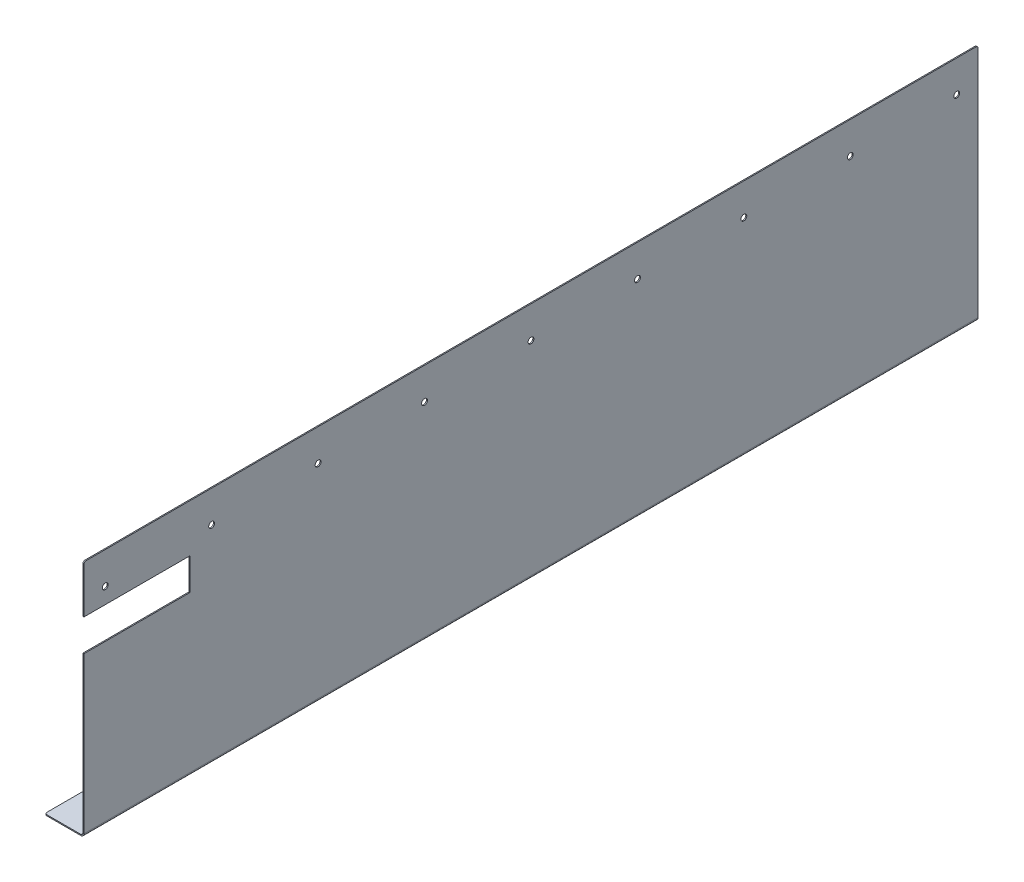
ISO-10303-21;
HEADER;
FILE_DESCRIPTION(('STEP AP214'),'2;1');
FILE_NAME('part.step','',(''),(''),'','','');
FILE_SCHEMA(('AUTOMOTIVE_DESIGN { 1 0 10303 214 1 1 1 1 }'));
ENDSEC;
DATA;
#1=APPLICATION_CONTEXT('core data for automotive mechanical design processes');
#2=APPLICATION_PROTOCOL_DEFINITION('international standard','automotive_design',2000,#1);
#3=PRODUCT_CONTEXT('',#1,'mechanical');
#4=PRODUCT('Part','Part','',(#3));
#5=PRODUCT_RELATED_PRODUCT_CATEGORY('part','',(#4));
#6=PRODUCT_DEFINITION_FORMATION('','',#4);
#7=PRODUCT_DEFINITION_CONTEXT('part definition',#1,'design');
#8=PRODUCT_DEFINITION('design','',#6,#7);
#9=PRODUCT_DEFINITION_SHAPE('','',#8);
#10=(LENGTH_UNIT() NAMED_UNIT(*) SI_UNIT(.MILLI.,.METRE.));
#11=(NAMED_UNIT(*) PLANE_ANGLE_UNIT() SI_UNIT($,.RADIAN.));
#12=(NAMED_UNIT(*) SI_UNIT($,.STERADIAN.) SOLID_ANGLE_UNIT());
#13=UNCERTAINTY_MEASURE_WITH_UNIT(LENGTH_MEASURE(1.E-05),#10,'distance_accuracy_value','');
#14=(GEOMETRIC_REPRESENTATION_CONTEXT(3) GLOBAL_UNCERTAINTY_ASSIGNED_CONTEXT((#13)) GLOBAL_UNIT_ASSIGNED_CONTEXT((#10,
#11,#12)) REPRESENTATION_CONTEXT('',''));
#15=CARTESIAN_POINT('',(0.,0.,0.));
#16=DIRECTION('',(0.,0.,1.));
#17=DIRECTION('',(1.,0.,0.));
#18=AXIS2_PLACEMENT_3D('',#15,#16,#17);
#19=CARTESIAN_POINT('',(0.,0.,421.5));
#20=DIRECTION('',(0.,0.,1.));
#21=DIRECTION('',(-1.,0.,0.));
#22=AXIS2_PLACEMENT_3D('',#19,#20,#21);
#23=PLANE('',#22);
#24=DIRECTION('',(0.,1.,0.));
#25=VECTOR('',#24,1.);
#26=CARTESIAN_POINT('',(0.,0.,421.5));
#27=LINE('',#26,#25);
#28=CARTESIAN_POINT('',(0.,180.,421.5));
#29=VERTEX_POINT('',#28);
#30=CARTESIAN_POINT('',(0.,223.,421.5));
#31=VERTEX_POINT('',#30);
#32=EDGE_CURVE('E188',#29,#31,#27,.T.);
#33=ORIENTED_EDGE('',*,*,#32,.F.);
#34=DIRECTION('',(-1.,0.,0.));
#35=VECTOR('',#34,1.);
#36=CARTESIAN_POINT('',(1.001,180.,421.5));
#37=LINE('',#36,#35);
#38=CARTESIAN_POINT('',(1.,180.,421.5));
#39=VERTEX_POINT('',#38);
#40=EDGE_CURVE('E298',#39,#29,#37,.T.);
#41=ORIENTED_EDGE('',*,*,#40,.F.);
#42=DIRECTION('',(0.,1.,0.));
#43=VECTOR('',#42,1.);
#44=CARTESIAN_POINT('',(1.,0.,421.5));
#45=LINE('',#44,#43);
#46=CARTESIAN_POINT('',(1.,223.,421.5));
#47=VERTEX_POINT('',#46);
#48=EDGE_CURVE('E257',#39,#47,#45,.T.);
#49=ORIENTED_EDGE('',*,*,#48,.T.);
#50=DIRECTION('',(1.,0.,0.));
#51=VECTOR('',#50,1.);
#52=CARTESIAN_POINT('',(0.,223.,421.5));
#53=LINE('',#52,#51);
#54=EDGE_CURVE('E11',#31,#47,#53,.T.);
#55=ORIENTED_EDGE('',*,*,#54,.F.);
#56=EDGE_LOOP('',(#33,#41,#49,#55));
#57=FACE_BOUND('',#56,.T.);
#58=ADVANCED_FACE('F45',(#57),#23,.T.);
#59=CARTESIAN_POINT('',(1.,0.,-421.5));
#60=DIRECTION('',(-1.,0.,0.));
#61=DIRECTION('',(0.,0.,-1.));
#62=AXIS2_PLACEMENT_3D('',#59,#60,#61);
#63=PLANE('',#62);
#64=CARTESIAN_POINT('',(1.,195.,301.125));
#65=DIRECTION('',(1.,0.,0.));
#66=DIRECTION('',(0.,0.,-1.));
#67=AXIS2_PLACEMENT_3D('',#64,#65,#66);
#68=CIRCLE('',#67,2.75);
#69=CARTESIAN_POINT('',(1.,195.,298.375));
#70=VERTEX_POINT('',#69);
#71=EDGE_CURVE('E388',#70,#70,#68,.T.);
#72=ORIENTED_EDGE('',*,*,#71,.F.);
#73=EDGE_LOOP('',(#72));
#74=FACE_BOUND('',#73,.T.);
#75=CARTESIAN_POINT('',(1.,195.,200.75));
#76=DIRECTION('',(1.,0.,0.));
#77=DIRECTION('',(0.,0.,-1.));
#78=AXIS2_PLACEMENT_3D('',#75,#76,#77);
#79=CIRCLE('',#78,2.75);
#80=CARTESIAN_POINT('',(1.,195.,198.));
#81=VERTEX_POINT('',#80);
#82=EDGE_CURVE('E381',#81,#81,#79,.T.);
#83=ORIENTED_EDGE('',*,*,#82,.F.);
#84=EDGE_LOOP('',(#83));
#85=FACE_BOUND('',#84,.T.);
#86=CARTESIAN_POINT('',(1.,195.,100.375));
#87=DIRECTION('',(1.,0.,0.));
#88=DIRECTION('',(0.,0.,-1.));
#89=AXIS2_PLACEMENT_3D('',#86,#87,#88);
#90=CIRCLE('',#89,2.75);
#91=CARTESIAN_POINT('',(1.,195.,97.625));
#92=VERTEX_POINT('',#91);
#93=EDGE_CURVE('E372',#92,#92,#90,.T.);
#94=ORIENTED_EDGE('',*,*,#93,.F.);
#95=EDGE_LOOP('',(#94));
#96=FACE_BOUND('',#95,.T.);
#97=CARTESIAN_POINT('',(1.,195.,0.));
#98=DIRECTION('',(1.,0.,0.));
#99=DIRECTION('',(0.,0.,-1.));
#100=AXIS2_PLACEMENT_3D('',#97,#98,#99);
#101=CIRCLE('',#100,2.75);
#102=CARTESIAN_POINT('',(1.,195.,-2.75));
#103=VERTEX_POINT('',#102);
#104=EDGE_CURVE('E363',#103,#103,#101,.T.);
#105=ORIENTED_EDGE('',*,*,#104,.F.);
#106=EDGE_LOOP('',(#105));
#107=FACE_BOUND('',#106,.T.);
#108=CARTESIAN_POINT('',(1.,195.,-100.375));
#109=DIRECTION('',(1.,0.,0.));
#110=DIRECTION('',(0.,0.,-1.));
#111=AXIS2_PLACEMENT_3D('',#108,#109,#110);
#112=CIRCLE('',#111,2.75);
#113=CARTESIAN_POINT('',(1.,195.,-103.125));
#114=VERTEX_POINT('',#113);
#115=EDGE_CURVE('E354',#114,#114,#112,.T.);
#116=ORIENTED_EDGE('',*,*,#115,.F.);
#117=EDGE_LOOP('',(#116));
#118=FACE_BOUND('',#117,.T.);
#119=CARTESIAN_POINT('',(1.,195.,-200.75));
#120=DIRECTION('',(1.,0.,0.));
#121=DIRECTION('',(0.,0.,-1.));
#122=AXIS2_PLACEMENT_3D('',#119,#120,#121);
#123=CIRCLE('',#122,2.75);
#124=CARTESIAN_POINT('',(1.,195.,-203.5));
#125=VERTEX_POINT('',#124);
#126=EDGE_CURVE('E345',#125,#125,#123,.T.);
#127=ORIENTED_EDGE('',*,*,#126,.F.);
#128=EDGE_LOOP('',(#127));
#129=FACE_BOUND('',#128,.T.);
#130=CARTESIAN_POINT('',(1.,195.,-301.125));
#131=DIRECTION('',(1.,0.,0.));
#132=DIRECTION('',(0.,0.,-1.));
#133=AXIS2_PLACEMENT_3D('',#130,#131,#132);
#134=CIRCLE('',#133,2.75);
#135=CARTESIAN_POINT('',(1.,195.,-303.875));
#136=VERTEX_POINT('',#135);
#137=EDGE_CURVE('E336',#136,#136,#134,.T.);
#138=ORIENTED_EDGE('',*,*,#137,.F.);
#139=EDGE_LOOP('',(#138));
#140=FACE_BOUND('',#139,.T.);
#141=CARTESIAN_POINT('',(1.,195.,-401.5));
#142=DIRECTION('',(1.,0.,0.));
#143=DIRECTION('',(0.,0.,-1.));
#144=AXIS2_PLACEMENT_3D('',#141,#142,#143);
#145=CIRCLE('',#144,2.75);
#146=CARTESIAN_POINT('',(1.,195.,-404.25));
#147=VERTEX_POINT('',#146);
#148=EDGE_CURVE('E326',#147,#147,#145,.T.);
#149=ORIENTED_EDGE('',*,*,#148,.F.);
#150=EDGE_LOOP('',(#149));
#151=FACE_BOUND('',#150,.T.);
#152=CARTESIAN_POINT('',(1.,195.,401.5));
#153=DIRECTION('',(1.,0.,0.));
#154=DIRECTION('',(0.,0.,-1.));
#155=AXIS2_PLACEMENT_3D('',#152,#153,#154);
#156=CIRCLE('',#155,2.75);
#157=CARTESIAN_POINT('',(1.,195.,398.75));
#158=VERTEX_POINT('',#157);
#159=EDGE_CURVE('E312',#158,#158,#156,.T.);
#160=ORIENTED_EDGE('',*,*,#159,.F.);
#161=EDGE_LOOP('',(#160));
#162=FACE_BOUND('',#161,.T.);
#163=DIRECTION('',(0.,0.,1.));
#164=VECTOR('',#163,1.);
#165=CARTESIAN_POINT('',(1.,225.,-421.5));
#166=LINE('',#165,#164);
#167=CARTESIAN_POINT('',(1.,225.,-419.5));
#168=VERTEX_POINT('',#167);
#169=CARTESIAN_POINT('',(1.,225.,419.5));
#170=VERTEX_POINT('',#169);
#171=EDGE_CURVE('E200',#168,#170,#166,.T.);
#172=ORIENTED_EDGE('',*,*,#171,.T.);
#173=CARTESIAN_POINT('',(1.,223.,419.5));
#174=DIRECTION('',(1.,0.,0.));
#175=DIRECTION('',(0.,0.,-1.));
#176=AXIS2_PLACEMENT_3D('',#173,#174,#175);
#177=CIRCLE('',#176,2.);
#178=EDGE_CURVE('E227',#47,#170,#177,.F.);
#179=ORIENTED_EDGE('',*,*,#178,.F.);
#180=ORIENTED_EDGE('',*,*,#48,.F.);
#181=DIRECTION('',(0.,0.,-1.));
#182=VECTOR('',#181,1.);
#183=CARTESIAN_POINT('',(1.,180.,421.5));
#184=LINE('',#183,#182);
#185=CARTESIAN_POINT('',(1.,180.,321.5));
#186=VERTEX_POINT('',#185);
#187=EDGE_CURVE('E181',#39,#186,#184,.T.);
#188=ORIENTED_EDGE('',*,*,#187,.T.);
#189=DIRECTION('',(0.,-1.,0.));
#190=VECTOR('',#189,1.);
#191=CARTESIAN_POINT('',(1.,180.,321.5));
#192=LINE('',#191,#190);
#193=CARTESIAN_POINT('',(1.,150.,321.5));
#194=VERTEX_POINT('',#193);
#195=EDGE_CURVE('E309',#186,#194,#192,.T.);
#196=ORIENTED_EDGE('',*,*,#195,.T.);
#197=DIRECTION('',(0.,0.,1.));
#198=VECTOR('',#197,1.);
#199=CARTESIAN_POINT('',(1.,150.,421.5));
#200=LINE('',#199,#198);
#201=CARTESIAN_POINT('',(1.,150.,421.5));
#202=VERTEX_POINT('',#201);
#203=EDGE_CURVE('E274',#194,#202,#200,.T.);
#204=ORIENTED_EDGE('',*,*,#203,.T.);
#205=CARTESIAN_POINT('',(1.,2.99999999999999,421.5));
#206=VERTEX_POINT('',#205);
#207=EDGE_CURVE('E167',#206,#202,#45,.T.);
#208=ORIENTED_EDGE('',*,*,#207,.F.);
#209=DIRECTION('',(0.,0.,-1.));
#210=VECTOR('',#209,1.);
#211=CARTESIAN_POINT('',(1.,2.99999999999999,-421.5));
#212=LINE('',#211,#210);
#213=CARTESIAN_POINT('',(1.,2.99999999999999,-421.5));
#214=VERTEX_POINT('',#213);
#215=EDGE_CURVE('E246',#214,#206,#212,.F.);
#216=ORIENTED_EDGE('',*,*,#215,.F.);
#217=DIRECTION('',(0.,1.,0.));
#218=VECTOR('',#217,1.);
#219=CARTESIAN_POINT('',(1.,0.,-421.5));
#220=LINE('',#219,#218);
#221=CARTESIAN_POINT('',(1.,223.,-421.5));
#222=VERTEX_POINT('',#221);
#223=EDGE_CURVE('E187',#214,#222,#220,.T.);
#224=ORIENTED_EDGE('',*,*,#223,.T.);
#225=CARTESIAN_POINT('',(1.,223.,-419.5));
#226=DIRECTION('',(1.,0.,0.));
#227=DIRECTION('',(0.,0.,-1.));
#228=AXIS2_PLACEMENT_3D('',#225,#226,#227);
#229=CIRCLE('',#228,2.);
#230=EDGE_CURVE('E230',#168,#222,#229,.F.);
#231=ORIENTED_EDGE('',*,*,#230,.F.);
#232=EDGE_LOOP('',(#172,#179,#180,#188,#196,#204,#208,#216,#224,#231));
#233=FACE_BOUND('',#232,.T.);
#234=ADVANCED_FACE('F241',(#74,#85,#96,#107,#118,#129,#140,#151,#162,#233),#63,.F.);
#235=CARTESIAN_POINT('',(0.,0.,-421.5));
#236=DIRECTION('',(-1.,0.,0.));
#237=DIRECTION('',(0.,0.,-1.));
#238=AXIS2_PLACEMENT_3D('',#235,#236,#237);
#239=PLANE('',#238);
#240=CARTESIAN_POINT('',(0.,195.,301.125));
#241=DIRECTION('',(1.,0.,0.));
#242=DIRECTION('',(0.,0.,-1.));
#243=AXIS2_PLACEMENT_3D('',#240,#241,#242);
#244=CIRCLE('',#243,2.775);
#245=CARTESIAN_POINT('',(0.,195.,298.35));
#246=VERTEX_POINT('',#245);
#247=EDGE_CURVE('E380',#246,#246,#244,.T.);
#248=ORIENTED_EDGE('',*,*,#247,.T.);
#249=EDGE_LOOP('',(#248));
#250=FACE_BOUND('',#249,.T.);
#251=CARTESIAN_POINT('',(0.,195.,200.75));
#252=DIRECTION('',(1.,0.,0.));
#253=DIRECTION('',(0.,0.,-1.));
#254=AXIS2_PLACEMENT_3D('',#251,#252,#253);
#255=CIRCLE('',#254,2.775);
#256=CARTESIAN_POINT('',(0.,195.,197.975));
#257=VERTEX_POINT('',#256);
#258=EDGE_CURVE('E371',#257,#257,#255,.T.);
#259=ORIENTED_EDGE('',*,*,#258,.T.);
#260=EDGE_LOOP('',(#259));
#261=FACE_BOUND('',#260,.T.);
#262=CARTESIAN_POINT('',(0.,195.,100.375));
#263=DIRECTION('',(1.,0.,0.));
#264=DIRECTION('',(0.,0.,-1.));
#265=AXIS2_PLACEMENT_3D('',#262,#263,#264);
#266=CIRCLE('',#265,2.775);
#267=CARTESIAN_POINT('',(0.,195.,97.6));
#268=VERTEX_POINT('',#267);
#269=EDGE_CURVE('E362',#268,#268,#266,.T.);
#270=ORIENTED_EDGE('',*,*,#269,.T.);
#271=EDGE_LOOP('',(#270));
#272=FACE_BOUND('',#271,.T.);
#273=CARTESIAN_POINT('',(0.,195.,0.));
#274=DIRECTION('',(1.,0.,0.));
#275=DIRECTION('',(0.,0.,-1.));
#276=AXIS2_PLACEMENT_3D('',#273,#274,#275);
#277=CIRCLE('',#276,2.775);
#278=CARTESIAN_POINT('',(0.,195.,-2.775));
#279=VERTEX_POINT('',#278);
#280=EDGE_CURVE('E353',#279,#279,#277,.T.);
#281=ORIENTED_EDGE('',*,*,#280,.T.);
#282=EDGE_LOOP('',(#281));
#283=FACE_BOUND('',#282,.T.);
#284=CARTESIAN_POINT('',(0.,195.,-100.375));
#285=DIRECTION('',(1.,0.,0.));
#286=DIRECTION('',(0.,0.,-1.));
#287=AXIS2_PLACEMENT_3D('',#284,#285,#286);
#288=CIRCLE('',#287,2.775);
#289=CARTESIAN_POINT('',(0.,195.,-103.15));
#290=VERTEX_POINT('',#289);
#291=EDGE_CURVE('E344',#290,#290,#288,.T.);
#292=ORIENTED_EDGE('',*,*,#291,.T.);
#293=EDGE_LOOP('',(#292));
#294=FACE_BOUND('',#293,.T.);
#295=CARTESIAN_POINT('',(0.,195.,-200.75));
#296=DIRECTION('',(1.,0.,0.));
#297=DIRECTION('',(0.,0.,-1.));
#298=AXIS2_PLACEMENT_3D('',#295,#296,#297);
#299=CIRCLE('',#298,2.775);
#300=CARTESIAN_POINT('',(0.,195.,-203.525));
#301=VERTEX_POINT('',#300);
#302=EDGE_CURVE('E335',#301,#301,#299,.T.);
#303=ORIENTED_EDGE('',*,*,#302,.T.);
#304=EDGE_LOOP('',(#303));
#305=FACE_BOUND('',#304,.T.);
#306=CARTESIAN_POINT('',(0.,195.,-301.125));
#307=DIRECTION('',(1.,0.,0.));
#308=DIRECTION('',(0.,0.,-1.));
#309=AXIS2_PLACEMENT_3D('',#306,#307,#308);
#310=CIRCLE('',#309,2.775);
#311=CARTESIAN_POINT('',(0.,195.,-303.9));
#312=VERTEX_POINT('',#311);
#313=EDGE_CURVE('E325',#312,#312,#310,.T.);
#314=ORIENTED_EDGE('',*,*,#313,.T.);
#315=EDGE_LOOP('',(#314));
#316=FACE_BOUND('',#315,.T.);
#317=CARTESIAN_POINT('',(0.,195.,-401.5));
#318=DIRECTION('',(1.,0.,0.));
#319=DIRECTION('',(0.,0.,-1.));
#320=AXIS2_PLACEMENT_3D('',#317,#318,#319);
#321=CIRCLE('',#320,2.775);
#322=CARTESIAN_POINT('',(0.,195.,-404.275));
#323=VERTEX_POINT('',#322);
#324=EDGE_CURVE('E329',#323,#323,#321,.T.);
#325=ORIENTED_EDGE('',*,*,#324,.T.);
#326=EDGE_LOOP('',(#325));
#327=FACE_BOUND('',#326,.T.);
#328=CARTESIAN_POINT('',(0.,195.,401.5));
#329=DIRECTION('',(1.,0.,0.));
#330=DIRECTION('',(0.,0.,-1.));
#331=AXIS2_PLACEMENT_3D('',#328,#329,#330);
#332=CIRCLE('',#331,2.775);
#333=CARTESIAN_POINT('',(0.,195.,398.725));
#334=VERTEX_POINT('',#333);
#335=EDGE_CURVE('E318',#334,#334,#332,.T.);
#336=ORIENTED_EDGE('',*,*,#335,.T.);
#337=EDGE_LOOP('',(#336));
#338=FACE_BOUND('',#337,.T.);
#339=DIRECTION('',(0.,1.,0.));
#340=VECTOR('',#339,1.);
#341=CARTESIAN_POINT('',(0.,0.,-421.5));
#342=LINE('',#341,#340);
#343=CARTESIAN_POINT('',(0.,2.99999999999999,-421.5));
#344=VERTEX_POINT('',#343);
#345=CARTESIAN_POINT('',(0.,223.,-421.5));
#346=VERTEX_POINT('',#345);
#347=EDGE_CURVE('E191',#344,#346,#342,.T.);
#348=ORIENTED_EDGE('',*,*,#347,.F.);
#349=DIRECTION('',(0.,0.,-1.));
#350=VECTOR('',#349,1.);
#351=CARTESIAN_POINT('',(0.,2.99999999999999,-421.5));
#352=LINE('',#351,#350);
#353=CARTESIAN_POINT('',(0.,2.99999999999999,421.5));
#354=VERTEX_POINT('',#353);
#355=EDGE_CURVE('E186',#344,#354,#352,.F.);
#356=ORIENTED_EDGE('',*,*,#355,.T.);
#357=CARTESIAN_POINT('',(0.,150.,421.5));
#358=VERTEX_POINT('',#357);
#359=EDGE_CURVE('E164',#354,#358,#27,.T.);
#360=ORIENTED_EDGE('',*,*,#359,.T.);
#361=DIRECTION('',(0.,0.,-1.));
#362=VECTOR('',#361,1.);
#363=CARTESIAN_POINT('',(0.,150.,421.5));
#364=LINE('',#363,#362);
#365=CARTESIAN_POINT('',(0.,150.,321.5));
#366=VERTEX_POINT('',#365);
#367=EDGE_CURVE('E175',#358,#366,#364,.T.);
#368=ORIENTED_EDGE('',*,*,#367,.T.);
#369=DIRECTION('',(0.,1.,0.));
#370=VECTOR('',#369,1.);
#371=CARTESIAN_POINT('',(0.,180.,321.5));
#372=LINE('',#371,#370);
#373=CARTESIAN_POINT('',(0.,180.,321.5));
#374=VERTEX_POINT('',#373);
#375=EDGE_CURVE('E180',#366,#374,#372,.T.);
#376=ORIENTED_EDGE('',*,*,#375,.T.);
#377=DIRECTION('',(0.,0.,1.));
#378=VECTOR('',#377,1.);
#379=CARTESIAN_POINT('',(0.,180.,421.5));
#380=LINE('',#379,#378);
#381=EDGE_CURVE('E172',#374,#29,#380,.T.);
#382=ORIENTED_EDGE('',*,*,#381,.T.);
#383=ORIENTED_EDGE('',*,*,#32,.T.);
#384=CARTESIAN_POINT('',(0.,223.,419.5));
#385=DIRECTION('',(1.,0.,0.));
#386=DIRECTION('',(0.,0.,-1.));
#387=AXIS2_PLACEMENT_3D('',#384,#385,#386);
#388=CIRCLE('',#387,2.);
#389=CARTESIAN_POINT('',(0.,225.,419.5));
#390=VERTEX_POINT('',#389);
#391=EDGE_CURVE('E59',#390,#31,#388,.T.);
#392=ORIENTED_EDGE('',*,*,#391,.F.);
#393=DIRECTION('',(0.,0.,1.));
#394=VECTOR('',#393,1.);
#395=CARTESIAN_POINT('',(0.,225.,-421.5));
#396=LINE('',#395,#394);
#397=CARTESIAN_POINT('',(0.,225.,-419.5));
#398=VERTEX_POINT('',#397);
#399=EDGE_CURVE('E197',#398,#390,#396,.T.);
#400=ORIENTED_EDGE('',*,*,#399,.F.);
#401=CARTESIAN_POINT('',(0.,223.,-419.5));
#402=DIRECTION('',(1.,0.,0.));
#403=DIRECTION('',(0.,0.,-1.));
#404=AXIS2_PLACEMENT_3D('',#401,#402,#403);
#405=CIRCLE('',#404,2.);
#406=EDGE_CURVE('E53',#346,#398,#405,.T.);
#407=ORIENTED_EDGE('',*,*,#406,.F.);
#408=EDGE_LOOP('',(#348,#356,#360,#368,#376,#382,#383,#392,#400,#407));
#409=FACE_BOUND('',#408,.T.);
#410=ADVANCED_FACE('F184',(#250,#261,#272,#283,#294,#305,#316,#327,#338,#409),#239,.T.);
#411=CARTESIAN_POINT('',(0.,0.,-421.5));
#412=DIRECTION('',(0.,0.,1.));
#413=DIRECTION('',(-1.,0.,0.));
#414=AXIS2_PLACEMENT_3D('',#411,#412,#413);
#415=PLANE('',#414);
#416=ORIENTED_EDGE('',*,*,#223,.F.);
#417=DIRECTION('',(1.,0.,0.));
#418=VECTOR('',#417,1.);
#419=CARTESIAN_POINT('',(0.,2.99999999999999,-421.5));
#420=LINE('',#419,#418);
#421=EDGE_CURVE('E251',#344,#214,#420,.T.);
#422=ORIENTED_EDGE('',*,*,#421,.F.);
#423=ORIENTED_EDGE('',*,*,#347,.T.);
#424=DIRECTION('',(1.,0.,0.));
#425=VECTOR('',#424,1.);
#426=CARTESIAN_POINT('',(0.,223.,-421.5));
#427=LINE('',#426,#425);
#428=EDGE_CURVE('E67',#222,#346,#427,.F.);
#429=ORIENTED_EDGE('',*,*,#428,.F.);
#430=EDGE_LOOP('',(#416,#422,#423,#429));
#431=FACE_BOUND('',#430,.T.);
#432=ADVANCED_FACE('F249',(#431),#415,.F.);
#433=CARTESIAN_POINT('',(0.,225.,-421.5));
#434=DIRECTION('',(0.,1.,0.));
#435=DIRECTION('',(0.,0.,-1.));
#436=AXIS2_PLACEMENT_3D('',#433,#434,#435);
#437=PLANE('',#436);
#438=ORIENTED_EDGE('',*,*,#399,.T.);
#439=DIRECTION('',(1.,0.,0.));
#440=VECTOR('',#439,1.);
#441=CARTESIAN_POINT('',(0.,225.,419.5));
#442=LINE('',#441,#440);
#443=EDGE_CURVE('E223',#170,#390,#442,.F.);
#444=ORIENTED_EDGE('',*,*,#443,.F.);
#445=ORIENTED_EDGE('',*,*,#171,.F.);
#446=DIRECTION('',(1.,0.,0.));
#447=VECTOR('',#446,1.);
#448=CARTESIAN_POINT('',(1.,225.,-419.5));
#449=LINE('',#448,#447);
#450=EDGE_CURVE('E225',#398,#168,#449,.T.);
#451=ORIENTED_EDGE('',*,*,#450,.F.);
#452=EDGE_LOOP('',(#438,#444,#445,#451));
#453=FACE_BOUND('',#452,.T.);
#454=ADVANCED_FACE('F238',(#453),#437,.T.);
#455=DIRECTION('',(-1.,0.,0.));
#456=VECTOR('',#455,1.);
#457=CARTESIAN_POINT('',(1.001,150.,421.5));
#458=LINE('',#457,#456);
#459=EDGE_CURVE('E159',#202,#358,#458,.T.);
#460=ORIENTED_EDGE('',*,*,#459,.T.);
#461=ORIENTED_EDGE('',*,*,#359,.F.);
#462=DIRECTION('',(1.,0.,0.));
#463=VECTOR('',#462,1.);
#464=CARTESIAN_POINT('',(0.,2.99999999999999,421.5));
#465=LINE('',#464,#463);
#466=EDGE_CURVE('E254',#354,#206,#465,.T.);
#467=ORIENTED_EDGE('',*,*,#466,.T.);
#468=ORIENTED_EDGE('',*,*,#207,.T.);
#469=EDGE_LOOP('',(#460,#461,#467,#468));
#470=FACE_BOUND('',#469,.T.);
#471=ADVANCED_FACE('F161',(#470),#23,.T.);
#472=CARTESIAN_POINT('',(-2.,2.99999999999999,421.5));
#473=DIRECTION('',(0.,0.,1.));
#474=DIRECTION('',(-1.,0.,0.));
#475=AXIS2_PLACEMENT_3D('',#472,#473,#474);
#476=PLANE('',#475);
#477=DIRECTION('',(0.,1.,0.));
#478=VECTOR('',#477,1.);
#479=CARTESIAN_POINT('',(-1.99999999999999,0.,421.5));
#480=LINE('',#479,#478);
#481=CARTESIAN_POINT('',(-1.99999999999999,0.999999999999993,421.5));
#482=VERTEX_POINT('',#481);
#483=CARTESIAN_POINT('',(-1.99999999999999,0.,421.5));
#484=VERTEX_POINT('',#483);
#485=EDGE_CURVE('E270',#482,#484,#480,.F.);
#486=ORIENTED_EDGE('',*,*,#485,.T.);
#487=CARTESIAN_POINT('',(-2.,2.99999999999999,421.5));
#488=DIRECTION('',(0.,0.,1.));
#489=DIRECTION('',(1.,0.,0.));
#490=AXIS2_PLACEMENT_3D('',#487,#488,#489);
#491=CIRCLE('',#490,3.);
#492=EDGE_CURVE('E255',#206,#484,#491,.F.);
#493=ORIENTED_EDGE('',*,*,#492,.F.);
#494=ORIENTED_EDGE('',*,*,#466,.F.);
#495=CARTESIAN_POINT('',(-2.,2.99999999999999,421.5));
#496=DIRECTION('',(0.,0.,1.));
#497=DIRECTION('',(1.,0.,0.));
#498=AXIS2_PLACEMENT_3D('',#495,#496,#497);
#499=CIRCLE('',#498,2.);
#500=EDGE_CURVE('E262',#354,#482,#499,.F.);
#501=ORIENTED_EDGE('',*,*,#500,.T.);
#502=EDGE_LOOP('',(#486,#493,#494,#501));
#503=FACE_BOUND('',#502,.T.);
#504=ADVANCED_FACE('F424',(#503),#476,.T.);
#505=CARTESIAN_POINT('',(-2.,2.99999999999999,-421.5));
#506=DIRECTION('',(0.,0.,1.));
#507=DIRECTION('',(-1.,0.,0.));
#508=AXIS2_PLACEMENT_3D('',#505,#506,#507);
#509=PLANE('',#508);
#510=CARTESIAN_POINT('',(-2.,2.99999999999999,-421.5));
#511=DIRECTION('',(0.,0.,1.));
#512=DIRECTION('',(1.,0.,0.));
#513=AXIS2_PLACEMENT_3D('',#510,#511,#512);
#514=CIRCLE('',#513,2.);
#515=CARTESIAN_POINT('',(-1.99999999999999,0.999999999999993,-421.5));
#516=VERTEX_POINT('',#515);
#517=EDGE_CURVE('E258',#516,#344,#514,.T.);
#518=ORIENTED_EDGE('',*,*,#517,.T.);
#519=ORIENTED_EDGE('',*,*,#421,.T.);
#520=CARTESIAN_POINT('',(-2.,2.99999999999999,-421.5));
#521=DIRECTION('',(0.,0.,1.));
#522=DIRECTION('',(1.,0.,0.));
#523=AXIS2_PLACEMENT_3D('',#520,#521,#522);
#524=CIRCLE('',#523,3.);
#525=CARTESIAN_POINT('',(-1.99999999999999,0.,-421.5));
#526=VERTEX_POINT('',#525);
#527=EDGE_CURVE('E265',#526,#214,#524,.T.);
#528=ORIENTED_EDGE('',*,*,#527,.F.);
#529=DIRECTION('',(0.,1.,0.));
#530=VECTOR('',#529,1.);
#531=CARTESIAN_POINT('',(-1.99999999999999,0.999999999999993,-421.5));
#532=LINE('',#531,#530);
#533=EDGE_CURVE('E277',#516,#526,#532,.F.);
#534=ORIENTED_EDGE('',*,*,#533,.F.);
#535=EDGE_LOOP('',(#518,#519,#528,#534));
#536=FACE_BOUND('',#535,.T.);
#537=ADVANCED_FACE('F429',(#536),#509,.F.);
#538=CARTESIAN_POINT('',(-2.,2.99999999999999,-421.5));
#539=DIRECTION('',(0.,0.,-1.));
#540=DIRECTION('',(0.,-1.,0.));
#541=AXIS2_PLACEMENT_3D('',#538,#539,#540);
#542=CYLINDRICAL_SURFACE('',#541,3.);
#543=ORIENTED_EDGE('',*,*,#215,.T.);
#544=ORIENTED_EDGE('',*,*,#492,.T.);
#545=DIRECTION('',(0.,0.,-1.));
#546=VECTOR('',#545,1.);
#547=CARTESIAN_POINT('',(-1.99999999999999,0.,421.5));
#548=LINE('',#547,#546);
#549=EDGE_CURVE('E280',#526,#484,#548,.F.);
#550=ORIENTED_EDGE('',*,*,#549,.F.);
#551=ORIENTED_EDGE('',*,*,#527,.T.);
#552=EDGE_LOOP('',(#543,#544,#550,#551));
#553=FACE_BOUND('',#552,.T.);
#554=ADVANCED_FACE('F748',(#553),#542,.T.);
#555=CARTESIAN_POINT('',(-2.,2.99999999999999,-421.5));
#556=DIRECTION('',(0.,0.,-1.));
#557=DIRECTION('',(0.,-1.,0.));
#558=AXIS2_PLACEMENT_3D('',#555,#556,#557);
#559=CYLINDRICAL_SURFACE('',#558,2.);
#560=ORIENTED_EDGE('',*,*,#355,.F.);
#561=ORIENTED_EDGE('',*,*,#517,.F.);
#562=DIRECTION('',(0.,0.,-1.));
#563=VECTOR('',#562,1.);
#564=CARTESIAN_POINT('',(-1.99999999999999,0.999999999999993,421.5));
#565=LINE('',#564,#563);
#566=EDGE_CURVE('E273',#482,#516,#565,.T.);
#567=ORIENTED_EDGE('',*,*,#566,.F.);
#568=ORIENTED_EDGE('',*,*,#500,.F.);
#569=EDGE_LOOP('',(#560,#561,#567,#568));
#570=FACE_BOUND('',#569,.T.);
#571=ADVANCED_FACE('F737',(#570),#559,.F.);
#572=CARTESIAN_POINT('',(-36.,-1.25767452008319E-13,-421.5));
#573=DIRECTION('',(0.,0.,1.));
#574=DIRECTION('',(-1.,0.,0.));
#575=AXIS2_PLACEMENT_3D('',#572,#573,#574);
#576=PLANE('',#575);
#577=DIRECTION('',(1.,0.,0.));
#578=VECTOR('',#577,1.);
#579=CARTESIAN_POINT('',(-36.,0.999999999999874,-421.5));
#580=LINE('',#579,#578);
#581=CARTESIAN_POINT('',(-34.,0.999999999999881,-421.5));
#582=VERTEX_POINT('',#581);
#583=EDGE_CURVE('E283',#516,#582,#580,.F.);
#584=ORIENTED_EDGE('',*,*,#583,.F.);
#585=ORIENTED_EDGE('',*,*,#533,.T.);
#586=DIRECTION('',(-1.,0.,0.));
#587=VECTOR('',#586,1.);
#588=CARTESIAN_POINT('',(-6.464515809938E-13,0.,-421.5));
#589=LINE('',#588,#587);
#590=CARTESIAN_POINT('',(-34.,-1.18710365520667E-13,-421.5));
#591=VERTEX_POINT('',#590);
#592=EDGE_CURVE('E291',#526,#591,#589,.T.);
#593=ORIENTED_EDGE('',*,*,#592,.T.);
#594=DIRECTION('',(0.,1.,0.));
#595=VECTOR('',#594,1.);
#596=CARTESIAN_POINT('',(-34.,-1.18784489330632E-13,-421.5));
#597=LINE('',#596,#595);
#598=EDGE_CURVE('E212',#582,#591,#597,.F.);
#599=ORIENTED_EDGE('',*,*,#598,.F.);
#600=EDGE_LOOP('',(#584,#585,#593,#599));
#601=FACE_BOUND('',#600,.T.);
#602=ADVANCED_FACE('F726',(#601),#576,.F.);
#603=CARTESIAN_POINT('',(0.,0.,421.5));
#604=DIRECTION('',(0.,0.,-1.));
#605=DIRECTION('',(1.,0.,0.));
#606=AXIS2_PLACEMENT_3D('',#603,#604,#605);
#607=PLANE('',#606);
#608=DIRECTION('',(1.,0.,0.));
#609=VECTOR('',#608,1.);
#610=CARTESIAN_POINT('',(0.,0.,421.5));
#611=LINE('',#610,#609);
#612=CARTESIAN_POINT('',(-34.,-1.18710365520667E-13,421.5));
#613=VERTEX_POINT('',#612);
#614=EDGE_CURVE('E260',#613,#484,#611,.T.);
#615=ORIENTED_EDGE('',*,*,#614,.T.);
#616=ORIENTED_EDGE('',*,*,#485,.F.);
#617=DIRECTION('',(-1.,0.,0.));
#618=VECTOR('',#617,1.);
#619=CARTESIAN_POINT('',(0.,1.,421.5));
#620=LINE('',#619,#618);
#621=CARTESIAN_POINT('',(-34.,0.999999999999881,421.5));
#622=VERTEX_POINT('',#621);
#623=EDGE_CURVE('E289',#622,#482,#620,.F.);
#624=ORIENTED_EDGE('',*,*,#623,.F.);
#625=DIRECTION('',(0.,1.,0.));
#626=VECTOR('',#625,1.);
#627=CARTESIAN_POINT('',(-34.,-1.18710365520667E-13,421.5));
#628=LINE('',#627,#626);
#629=EDGE_CURVE('E220',#613,#622,#628,.T.);
#630=ORIENTED_EDGE('',*,*,#629,.F.);
#631=EDGE_LOOP('',(#615,#616,#624,#630));
#632=FACE_BOUND('',#631,.T.);
#633=ADVANCED_FACE('F715',(#632),#607,.F.);
#634=CARTESIAN_POINT('',(0.,0.,0.));
#635=DIRECTION('',(0.,1.,0.));
#636=DIRECTION('',(-1.,0.,0.));
#637=AXIS2_PLACEMENT_3D('',#634,#635,#636);
#638=PLANE('',#637);
#639=ORIENTED_EDGE('',*,*,#592,.F.);
#640=ORIENTED_EDGE('',*,*,#549,.T.);
#641=ORIENTED_EDGE('',*,*,#614,.F.);
#642=CARTESIAN_POINT('',(-34.,-1.18710365520667E-13,419.5));
#643=DIRECTION('',(0.,-1.,0.));
#644=DIRECTION('',(-1.,0.,0.));
#645=AXIS2_PLACEMENT_3D('',#642,#643,#644);
#646=CIRCLE('',#645,2.);
#647=CARTESIAN_POINT('',(-36.,-1.25693328198353E-13,419.5));
#648=VERTEX_POINT('',#647);
#649=EDGE_CURVE('E215',#648,#613,#646,.F.);
#650=ORIENTED_EDGE('',*,*,#649,.F.);
#651=DIRECTION('',(0.,0.,1.));
#652=VECTOR('',#651,1.);
#653=CARTESIAN_POINT('',(-36.,-1.25693328198353E-13,0.));
#654=LINE('',#653,#652);
#655=CARTESIAN_POINT('',(-36.,-1.25693328198353E-13,-419.5));
#656=VERTEX_POINT('',#655);
#657=EDGE_CURVE('E294',#656,#648,#654,.T.);
#658=ORIENTED_EDGE('',*,*,#657,.F.);
#659=CARTESIAN_POINT('',(-34.,-1.18710365520667E-13,-419.5));
#660=DIRECTION('',(0.,-1.,0.));
#661=DIRECTION('',(-1.,0.,0.));
#662=AXIS2_PLACEMENT_3D('',#659,#660,#661);
#663=CIRCLE('',#662,2.);
#664=EDGE_CURVE('E217',#591,#656,#663,.F.);
#665=ORIENTED_EDGE('',*,*,#664,.F.);
#666=EDGE_LOOP('',(#639,#640,#641,#650,#658,#665));
#667=FACE_BOUND('',#666,.T.);
#668=ADVANCED_FACE('F704',(#667),#638,.F.);
#669=CARTESIAN_POINT('',(0.,1.,0.));
#670=DIRECTION('',(0.,1.,0.));
#671=DIRECTION('',(-1.,0.,0.));
#672=AXIS2_PLACEMENT_3D('',#669,#670,#671);
#673=PLANE('',#672);
#674=DIRECTION('',(0.,0.,-1.));
#675=VECTOR('',#674,1.);
#676=CARTESIAN_POINT('',(-36.,0.999999999999874,421.5));
#677=LINE('',#676,#675);
#678=CARTESIAN_POINT('',(-36.,0.999999999999874,-419.5));
#679=VERTEX_POINT('',#678);
#680=CARTESIAN_POINT('',(-36.,0.999999999999874,419.5));
#681=VERTEX_POINT('',#680);
#682=EDGE_CURVE('E286',#679,#681,#677,.F.);
#683=ORIENTED_EDGE('',*,*,#682,.T.);
#684=CARTESIAN_POINT('',(-34.,0.999999999999881,419.5));
#685=DIRECTION('',(0.,-1.,0.));
#686=DIRECTION('',(-1.,0.,0.));
#687=AXIS2_PLACEMENT_3D('',#684,#685,#686);
#688=CIRCLE('',#687,2.);
#689=EDGE_CURVE('E207',#622,#681,#688,.T.);
#690=ORIENTED_EDGE('',*,*,#689,.F.);
#691=ORIENTED_EDGE('',*,*,#623,.T.);
#692=ORIENTED_EDGE('',*,*,#566,.T.);
#693=ORIENTED_EDGE('',*,*,#583,.T.);
#694=CARTESIAN_POINT('',(-34.,0.999999999999881,-419.5));
#695=DIRECTION('',(0.,-1.,0.));
#696=DIRECTION('',(-1.,0.,0.));
#697=AXIS2_PLACEMENT_3D('',#694,#695,#696);
#698=CIRCLE('',#697,2.);
#699=EDGE_CURVE('E210',#679,#582,#698,.T.);
#700=ORIENTED_EDGE('',*,*,#699,.F.);
#701=EDGE_LOOP('',(#683,#690,#691,#692,#693,#700));
#702=FACE_BOUND('',#701,.T.);
#703=ADVANCED_FACE('F693',(#702),#673,.T.);
#704=CARTESIAN_POINT('',(-36.,-1.25767452008319E-13,421.5));
#705=DIRECTION('',(1.,0.,0.));
#706=DIRECTION('',(0.,1.,0.));
#707=AXIS2_PLACEMENT_3D('',#704,#705,#706);
#708=PLANE('',#707);
#709=ORIENTED_EDGE('',*,*,#657,.T.);
#710=DIRECTION('',(0.,1.,0.));
#711=VECTOR('',#710,1.);
#712=CARTESIAN_POINT('',(-36.,-1.25767452008319E-13,419.5));
#713=LINE('',#712,#711);
#714=EDGE_CURVE('E203',#681,#648,#713,.F.);
#715=ORIENTED_EDGE('',*,*,#714,.F.);
#716=ORIENTED_EDGE('',*,*,#682,.F.);
#717=DIRECTION('',(0.,1.,0.));
#718=VECTOR('',#717,1.);
#719=CARTESIAN_POINT('',(-36.,-1.25767452008319E-13,-419.5));
#720=LINE('',#719,#718);
#721=EDGE_CURVE('E205',#656,#679,#720,.T.);
#722=ORIENTED_EDGE('',*,*,#721,.F.);
#723=EDGE_LOOP('',(#709,#715,#716,#722));
#724=FACE_BOUND('',#723,.T.);
#725=ADVANCED_FACE('F682',(#724),#708,.F.);
#726=CARTESIAN_POINT('',(1.001,180.,421.5));
#727=DIRECTION('',(0.,1.,0.));
#728=DIRECTION('',(0.,0.,-1.));
#729=AXIS2_PLACEMENT_3D('',#726,#727,#728);
#730=PLANE('',#729);
#731=ORIENTED_EDGE('',*,*,#187,.F.);
#732=ORIENTED_EDGE('',*,*,#40,.T.);
#733=ORIENTED_EDGE('',*,*,#381,.F.);
#734=DIRECTION('',(-1.,0.,0.));
#735=VECTOR('',#734,1.);
#736=CARTESIAN_POINT('',(1.001,180.,321.5));
#737=LINE('',#736,#735);
#738=EDGE_CURVE('E301',#186,#374,#737,.T.);
#739=ORIENTED_EDGE('',*,*,#738,.F.);
#740=EDGE_LOOP('',(#731,#732,#733,#739));
#741=FACE_BOUND('',#740,.T.);
#742=ADVANCED_FACE('F671',(#741),#730,.F.);
#743=CARTESIAN_POINT('',(1.001,180.,321.5));
#744=DIRECTION('',(0.,0.,-1.));
#745=DIRECTION('',(1.,0.,0.));
#746=AXIS2_PLACEMENT_3D('',#743,#744,#745);
#747=PLANE('',#746);
#748=ORIENTED_EDGE('',*,*,#195,.F.);
#749=ORIENTED_EDGE('',*,*,#738,.T.);
#750=ORIENTED_EDGE('',*,*,#375,.F.);
#751=DIRECTION('',(-1.,0.,0.));
#752=VECTOR('',#751,1.);
#753=CARTESIAN_POINT('',(1.001,150.,321.5));
#754=LINE('',#753,#752);
#755=EDGE_CURVE('E171',#194,#366,#754,.T.);
#756=ORIENTED_EDGE('',*,*,#755,.F.);
#757=EDGE_LOOP('',(#748,#749,#750,#756));
#758=FACE_BOUND('',#757,.T.);
#759=ADVANCED_FACE('F661',(#758),#747,.F.);
#760=CARTESIAN_POINT('',(1.001,150.,421.5));
#761=DIRECTION('',(0.,-1.,0.));
#762=DIRECTION('',(0.,0.,1.));
#763=AXIS2_PLACEMENT_3D('',#760,#761,#762);
#764=PLANE('',#763);
#765=ORIENTED_EDGE('',*,*,#203,.F.);
#766=ORIENTED_EDGE('',*,*,#755,.T.);
#767=ORIENTED_EDGE('',*,*,#367,.F.);
#768=ORIENTED_EDGE('',*,*,#459,.F.);
#769=EDGE_LOOP('',(#765,#766,#767,#768));
#770=FACE_BOUND('',#769,.T.);
#771=ADVANCED_FACE('F176',(#770),#764,.F.);
#772=CARTESIAN_POINT('',(0.,195.,401.5));
#773=DIRECTION('',(-1.,0.,0.));
#774=DIRECTION('',(0.,0.,-1.));
#775=AXIS2_PLACEMENT_3D('',#772,#773,#774);
#776=CYLINDRICAL_SURFACE('',#775,2.75);
#777=ORIENTED_EDGE('',*,*,#159,.T.);
#778=EDGE_LOOP('',(#777));
#779=FACE_BOUND('',#778,.T.);
#780=CARTESIAN_POINT('',(0.0250000000000025,195.,401.5));
#781=DIRECTION('',(1.,0.,0.));
#782=DIRECTION('',(0.,0.,-1.));
#783=AXIS2_PLACEMENT_3D('',#780,#781,#782);
#784=CIRCLE('',#783,2.75);
#785=CARTESIAN_POINT('',(0.0250000000000025,195.,398.75));
#786=VERTEX_POINT('',#785);
#787=EDGE_CURVE('E315',#786,#786,#784,.T.);
#788=ORIENTED_EDGE('',*,*,#787,.F.);
#789=EDGE_LOOP('',(#788));
#790=FACE_BOUND('',#789,.T.);
#791=ADVANCED_FACE('F640',(#779,#790),#776,.F.);
#792=CARTESIAN_POINT('',(0.,195.,401.5));
#793=DIRECTION('',(-1.,0.,0.));
#794=DIRECTION('',(0.,0.,-1.));
#795=AXIS2_PLACEMENT_3D('',#792,#793,#794);
#796=CONICAL_SURFACE('',#795,2.775,0.785398163397344);
#797=ORIENTED_EDGE('',*,*,#787,.T.);
#798=EDGE_LOOP('',(#797));
#799=FACE_BOUND('',#798,.T.);
#800=ORIENTED_EDGE('',*,*,#335,.F.);
#801=EDGE_LOOP('',(#800));
#802=FACE_BOUND('',#801,.T.);
#803=ADVANCED_FACE('F629',(#799,#802),#796,.F.);
#804=CARTESIAN_POINT('',(0.,195.,-401.5));
#805=DIRECTION('',(-1.,0.,0.));
#806=DIRECTION('',(0.,0.,-1.));
#807=AXIS2_PLACEMENT_3D('',#804,#805,#806);
#808=CYLINDRICAL_SURFACE('',#807,2.75);
#809=ORIENTED_EDGE('',*,*,#148,.T.);
#810=EDGE_LOOP('',(#809));
#811=FACE_BOUND('',#810,.T.);
#812=CARTESIAN_POINT('',(0.0250000000000025,195.,-401.5));
#813=DIRECTION('',(1.,0.,0.));
#814=DIRECTION('',(0.,0.,-1.));
#815=AXIS2_PLACEMENT_3D('',#812,#813,#814);
#816=CIRCLE('',#815,2.75);
#817=CARTESIAN_POINT('',(0.0250000000000025,195.,-404.25));
#818=VERTEX_POINT('',#817);
#819=EDGE_CURVE('E322',#818,#818,#816,.T.);
#820=ORIENTED_EDGE('',*,*,#819,.F.);
#821=EDGE_LOOP('',(#820));
#822=FACE_BOUND('',#821,.T.);
#823=ADVANCED_FACE('F618',(#811,#822),#808,.F.);
#824=CARTESIAN_POINT('',(0.,195.,-401.5));
#825=DIRECTION('',(-1.,0.,0.));
#826=DIRECTION('',(0.,0.,-1.));
#827=AXIS2_PLACEMENT_3D('',#824,#825,#826);
#828=CONICAL_SURFACE('',#827,2.775,0.785398163397344);
#829=ORIENTED_EDGE('',*,*,#819,.T.);
#830=EDGE_LOOP('',(#829));
#831=FACE_BOUND('',#830,.T.);
#832=ORIENTED_EDGE('',*,*,#324,.F.);
#833=EDGE_LOOP('',(#832));
#834=FACE_BOUND('',#833,.T.);
#835=ADVANCED_FACE('F607',(#831,#834),#828,.F.);
#836=CARTESIAN_POINT('',(0.,195.,-301.125));
#837=DIRECTION('',(-1.,0.,0.));
#838=DIRECTION('',(0.,0.,-1.));
#839=AXIS2_PLACEMENT_3D('',#836,#837,#838);
#840=CYLINDRICAL_SURFACE('',#839,2.75);
#841=ORIENTED_EDGE('',*,*,#137,.T.);
#842=EDGE_LOOP('',(#841));
#843=FACE_BOUND('',#842,.T.);
#844=CARTESIAN_POINT('',(0.0250000000000025,195.,-301.125));
#845=DIRECTION('',(1.,0.,0.));
#846=DIRECTION('',(0.,0.,-1.));
#847=AXIS2_PLACEMENT_3D('',#844,#845,#846);
#848=CIRCLE('',#847,2.75);
#849=CARTESIAN_POINT('',(0.0250000000000025,195.,-303.875));
#850=VERTEX_POINT('',#849);
#851=EDGE_CURVE('E332',#850,#850,#848,.T.);
#852=ORIENTED_EDGE('',*,*,#851,.F.);
#853=EDGE_LOOP('',(#852));
#854=FACE_BOUND('',#853,.T.);
#855=ADVANCED_FACE('F596',(#843,#854),#840,.F.);
#856=CARTESIAN_POINT('',(0.,195.,-301.125));
#857=DIRECTION('',(-1.,0.,0.));
#858=DIRECTION('',(0.,0.,-1.));
#859=AXIS2_PLACEMENT_3D('',#856,#857,#858);
#860=CONICAL_SURFACE('',#859,2.775,0.785398163397344);
#861=ORIENTED_EDGE('',*,*,#851,.T.);
#862=EDGE_LOOP('',(#861));
#863=FACE_BOUND('',#862,.T.);
#864=ORIENTED_EDGE('',*,*,#313,.F.);
#865=EDGE_LOOP('',(#864));
#866=FACE_BOUND('',#865,.T.);
#867=ADVANCED_FACE('F585',(#863,#866),#860,.F.);
#868=CARTESIAN_POINT('',(0.,195.,-200.75));
#869=DIRECTION('',(-1.,0.,0.));
#870=DIRECTION('',(0.,0.,-1.));
#871=AXIS2_PLACEMENT_3D('',#868,#869,#870);
#872=CYLINDRICAL_SURFACE('',#871,2.75);
#873=ORIENTED_EDGE('',*,*,#126,.T.);
#874=EDGE_LOOP('',(#873));
#875=FACE_BOUND('',#874,.T.);
#876=CARTESIAN_POINT('',(0.0250000000000025,195.,-200.75));
#877=DIRECTION('',(1.,0.,0.));
#878=DIRECTION('',(0.,0.,-1.));
#879=AXIS2_PLACEMENT_3D('',#876,#877,#878);
#880=CIRCLE('',#879,2.75);
#881=CARTESIAN_POINT('',(0.0250000000000025,195.,-203.5));
#882=VERTEX_POINT('',#881);
#883=EDGE_CURVE('E341',#882,#882,#880,.T.);
#884=ORIENTED_EDGE('',*,*,#883,.F.);
#885=EDGE_LOOP('',(#884));
#886=FACE_BOUND('',#885,.T.);
#887=ADVANCED_FACE('F574',(#875,#886),#872,.F.);
#888=CARTESIAN_POINT('',(0.,195.,-200.75));
#889=DIRECTION('',(-1.,0.,0.));
#890=DIRECTION('',(0.,0.,-1.));
#891=AXIS2_PLACEMENT_3D('',#888,#889,#890);
#892=CONICAL_SURFACE('',#891,2.775,0.785398163397344);
#893=ORIENTED_EDGE('',*,*,#883,.T.);
#894=EDGE_LOOP('',(#893));
#895=FACE_BOUND('',#894,.T.);
#896=ORIENTED_EDGE('',*,*,#302,.F.);
#897=EDGE_LOOP('',(#896));
#898=FACE_BOUND('',#897,.T.);
#899=ADVANCED_FACE('F563',(#895,#898),#892,.F.);
#900=CARTESIAN_POINT('',(0.,195.,-100.375));
#901=DIRECTION('',(-1.,0.,0.));
#902=DIRECTION('',(0.,0.,-1.));
#903=AXIS2_PLACEMENT_3D('',#900,#901,#902);
#904=CYLINDRICAL_SURFACE('',#903,2.75);
#905=ORIENTED_EDGE('',*,*,#115,.T.);
#906=EDGE_LOOP('',(#905));
#907=FACE_BOUND('',#906,.T.);
#908=CARTESIAN_POINT('',(0.0250000000000025,195.,-100.375));
#909=DIRECTION('',(1.,0.,0.));
#910=DIRECTION('',(0.,0.,-1.));
#911=AXIS2_PLACEMENT_3D('',#908,#909,#910);
#912=CIRCLE('',#911,2.75);
#913=CARTESIAN_POINT('',(0.0250000000000025,195.,-103.125));
#914=VERTEX_POINT('',#913);
#915=EDGE_CURVE('E350',#914,#914,#912,.T.);
#916=ORIENTED_EDGE('',*,*,#915,.F.);
#917=EDGE_LOOP('',(#916));
#918=FACE_BOUND('',#917,.T.);
#919=ADVANCED_FACE('F552',(#907,#918),#904,.F.);
#920=CARTESIAN_POINT('',(0.,195.,-100.375));
#921=DIRECTION('',(-1.,0.,0.));
#922=DIRECTION('',(0.,0.,-1.));
#923=AXIS2_PLACEMENT_3D('',#920,#921,#922);
#924=CONICAL_SURFACE('',#923,2.775,0.785398163397344);
#925=ORIENTED_EDGE('',*,*,#915,.T.);
#926=EDGE_LOOP('',(#925));
#927=FACE_BOUND('',#926,.T.);
#928=ORIENTED_EDGE('',*,*,#291,.F.);
#929=EDGE_LOOP('',(#928));
#930=FACE_BOUND('',#929,.T.);
#931=ADVANCED_FACE('F541',(#927,#930),#924,.F.);
#932=CARTESIAN_POINT('',(0.,195.,0.));
#933=DIRECTION('',(-1.,0.,0.));
#934=DIRECTION('',(0.,0.,-1.));
#935=AXIS2_PLACEMENT_3D('',#932,#933,#934);
#936=CYLINDRICAL_SURFACE('',#935,2.75);
#937=ORIENTED_EDGE('',*,*,#104,.T.);
#938=EDGE_LOOP('',(#937));
#939=FACE_BOUND('',#938,.T.);
#940=CARTESIAN_POINT('',(0.0250000000000025,195.,0.));
#941=DIRECTION('',(1.,0.,0.));
#942=DIRECTION('',(0.,0.,-1.));
#943=AXIS2_PLACEMENT_3D('',#940,#941,#942);
#944=CIRCLE('',#943,2.75);
#945=CARTESIAN_POINT('',(0.0250000000000025,195.,-2.75));
#946=VERTEX_POINT('',#945);
#947=EDGE_CURVE('E359',#946,#946,#944,.T.);
#948=ORIENTED_EDGE('',*,*,#947,.F.);
#949=EDGE_LOOP('',(#948));
#950=FACE_BOUND('',#949,.T.);
#951=ADVANCED_FACE('F530',(#939,#950),#936,.F.);
#952=CARTESIAN_POINT('',(0.,195.,0.));
#953=DIRECTION('',(-1.,0.,0.));
#954=DIRECTION('',(0.,0.,-1.));
#955=AXIS2_PLACEMENT_3D('',#952,#953,#954);
#956=CONICAL_SURFACE('',#955,2.775,0.785398163397344);
#957=ORIENTED_EDGE('',*,*,#947,.T.);
#958=EDGE_LOOP('',(#957));
#959=FACE_BOUND('',#958,.T.);
#960=ORIENTED_EDGE('',*,*,#280,.F.);
#961=EDGE_LOOP('',(#960));
#962=FACE_BOUND('',#961,.T.);
#963=ADVANCED_FACE('F519',(#959,#962),#956,.F.);
#964=CARTESIAN_POINT('',(0.,195.,100.375));
#965=DIRECTION('',(-1.,0.,0.));
#966=DIRECTION('',(0.,0.,-1.));
#967=AXIS2_PLACEMENT_3D('',#964,#965,#966);
#968=CYLINDRICAL_SURFACE('',#967,2.75);
#969=ORIENTED_EDGE('',*,*,#93,.T.);
#970=EDGE_LOOP('',(#969));
#971=FACE_BOUND('',#970,.T.);
#972=CARTESIAN_POINT('',(0.0250000000000025,195.,100.375));
#973=DIRECTION('',(1.,0.,0.));
#974=DIRECTION('',(0.,0.,-1.));
#975=AXIS2_PLACEMENT_3D('',#972,#973,#974);
#976=CIRCLE('',#975,2.75);
#977=CARTESIAN_POINT('',(0.0250000000000025,195.,97.625));
#978=VERTEX_POINT('',#977);
#979=EDGE_CURVE('E368',#978,#978,#976,.T.);
#980=ORIENTED_EDGE('',*,*,#979,.F.);
#981=EDGE_LOOP('',(#980));
#982=FACE_BOUND('',#981,.T.);
#983=ADVANCED_FACE('F508',(#971,#982),#968,.F.);
#984=CARTESIAN_POINT('',(0.,195.,100.375));
#985=DIRECTION('',(-1.,0.,0.));
#986=DIRECTION('',(0.,0.,-1.));
#987=AXIS2_PLACEMENT_3D('',#984,#985,#986);
#988=CONICAL_SURFACE('',#987,2.775,0.785398163397344);
#989=ORIENTED_EDGE('',*,*,#979,.T.);
#990=EDGE_LOOP('',(#989));
#991=FACE_BOUND('',#990,.T.);
#992=ORIENTED_EDGE('',*,*,#269,.F.);
#993=EDGE_LOOP('',(#992));
#994=FACE_BOUND('',#993,.T.);
#995=ADVANCED_FACE('F497',(#991,#994),#988,.F.);
#996=CARTESIAN_POINT('',(0.,195.,200.75));
#997=DIRECTION('',(-1.,0.,0.));
#998=DIRECTION('',(0.,0.,-1.));
#999=AXIS2_PLACEMENT_3D('',#996,#997,#998);
#1000=CYLINDRICAL_SURFACE('',#999,2.75);
#1001=ORIENTED_EDGE('',*,*,#82,.T.);
#1002=EDGE_LOOP('',(#1001));
#1003=FACE_BOUND('',#1002,.T.);
#1004=CARTESIAN_POINT('',(0.0250000000000025,195.,200.75));
#1005=DIRECTION('',(1.,0.,0.));
#1006=DIRECTION('',(0.,0.,-1.));
#1007=AXIS2_PLACEMENT_3D('',#1004,#1005,#1006);
#1008=CIRCLE('',#1007,2.75);
#1009=CARTESIAN_POINT('',(0.0250000000000025,195.,198.));
#1010=VERTEX_POINT('',#1009);
#1011=EDGE_CURVE('E377',#1010,#1010,#1008,.T.);
#1012=ORIENTED_EDGE('',*,*,#1011,.F.);
#1013=EDGE_LOOP('',(#1012));
#1014=FACE_BOUND('',#1013,.T.);
#1015=ADVANCED_FACE('F486',(#1003,#1014),#1000,.F.);
#1016=CARTESIAN_POINT('',(0.,195.,200.75));
#1017=DIRECTION('',(-1.,0.,0.));
#1018=DIRECTION('',(0.,0.,-1.));
#1019=AXIS2_PLACEMENT_3D('',#1016,#1017,#1018);
#1020=CONICAL_SURFACE('',#1019,2.775,0.785398163397344);
#1021=ORIENTED_EDGE('',*,*,#1011,.T.);
#1022=EDGE_LOOP('',(#1021));
#1023=FACE_BOUND('',#1022,.T.);
#1024=ORIENTED_EDGE('',*,*,#258,.F.);
#1025=EDGE_LOOP('',(#1024));
#1026=FACE_BOUND('',#1025,.T.);
#1027=ADVANCED_FACE('F409',(#1023,#1026),#1020,.F.);
#1028=CARTESIAN_POINT('',(0.,195.,301.125));
#1029=DIRECTION('',(-1.,0.,0.));
#1030=DIRECTION('',(0.,0.,-1.));
#1031=AXIS2_PLACEMENT_3D('',#1028,#1029,#1030);
#1032=CYLINDRICAL_SURFACE('',#1031,2.75);
#1033=ORIENTED_EDGE('',*,*,#71,.T.);
#1034=EDGE_LOOP('',(#1033));
#1035=FACE_BOUND('',#1034,.T.);
#1036=CARTESIAN_POINT('',(0.0250000000000025,195.,301.125));
#1037=DIRECTION('',(1.,0.,0.));
#1038=DIRECTION('',(0.,0.,-1.));
#1039=AXIS2_PLACEMENT_3D('',#1036,#1037,#1038);
#1040=CIRCLE('',#1039,2.75);
#1041=CARTESIAN_POINT('',(0.0250000000000025,195.,298.375));
#1042=VERTEX_POINT('',#1041);
#1043=EDGE_CURVE('E321',#1042,#1042,#1040,.T.);
#1044=ORIENTED_EDGE('',*,*,#1043,.F.);
#1045=EDGE_LOOP('',(#1044));
#1046=FACE_BOUND('',#1045,.T.);
#1047=ADVANCED_FACE('F399',(#1035,#1046),#1032,.F.);
#1048=CARTESIAN_POINT('',(0.,195.,301.125));
#1049=DIRECTION('',(-1.,0.,0.));
#1050=DIRECTION('',(0.,0.,-1.));
#1051=AXIS2_PLACEMENT_3D('',#1048,#1049,#1050);
#1052=CONICAL_SURFACE('',#1051,2.775,0.785398163397344);
#1053=ORIENTED_EDGE('',*,*,#1043,.T.);
#1054=EDGE_LOOP('',(#1053));
#1055=FACE_BOUND('',#1054,.T.);
#1056=ORIENTED_EDGE('',*,*,#247,.F.);
#1057=EDGE_LOOP('',(#1056));
#1058=FACE_BOUND('',#1057,.T.);
#1059=ADVANCED_FACE('F396',(#1055,#1058),#1052,.F.);
#1060=CARTESIAN_POINT('',(-34.,-1.18784489330632E-13,-419.5));
#1061=DIRECTION('',(0.,1.,0.));
#1062=DIRECTION('',(-1.,0.,0.));
#1063=AXIS2_PLACEMENT_3D('',#1060,#1061,#1062);
#1064=CYLINDRICAL_SURFACE('',#1063,2.);
#1065=ORIENTED_EDGE('',*,*,#664,.T.);
#1066=ORIENTED_EDGE('',*,*,#721,.T.);
#1067=ORIENTED_EDGE('',*,*,#699,.T.);
#1068=ORIENTED_EDGE('',*,*,#598,.T.);
#1069=EDGE_LOOP('',(#1065,#1066,#1067,#1068));
#1070=FACE_BOUND('',#1069,.T.);
#1071=ADVANCED_FACE('F398',(#1070),#1064,.T.);
#1072=CARTESIAN_POINT('',(-34.,-1.18710365520667E-13,419.5));
#1073=DIRECTION('',(0.,1.,0.));
#1074=DIRECTION('',(-1.,0.,0.));
#1075=AXIS2_PLACEMENT_3D('',#1072,#1073,#1074);
#1076=CYLINDRICAL_SURFACE('',#1075,2.);
#1077=ORIENTED_EDGE('',*,*,#649,.T.);
#1078=ORIENTED_EDGE('',*,*,#629,.T.);
#1079=ORIENTED_EDGE('',*,*,#689,.T.);
#1080=ORIENTED_EDGE('',*,*,#714,.T.);
#1081=EDGE_LOOP('',(#1077,#1078,#1079,#1080));
#1082=FACE_BOUND('',#1081,.T.);
#1083=ADVANCED_FACE('F406',(#1082),#1076,.T.);
#1084=CARTESIAN_POINT('',(0.,223.,-419.5));
#1085=DIRECTION('',(-1.,0.,0.));
#1086=DIRECTION('',(0.,0.,-1.));
#1087=AXIS2_PLACEMENT_3D('',#1084,#1085,#1086);
#1088=CYLINDRICAL_SURFACE('',#1087,2.);
#1089=ORIENTED_EDGE('',*,*,#406,.T.);
#1090=ORIENTED_EDGE('',*,*,#450,.T.);
#1091=ORIENTED_EDGE('',*,*,#230,.T.);
#1092=ORIENTED_EDGE('',*,*,#428,.T.);
#1093=EDGE_LOOP('',(#1089,#1090,#1091,#1092));
#1094=FACE_BOUND('',#1093,.T.);
#1095=ADVANCED_FACE('F234',(#1094),#1088,.T.);
#1096=CARTESIAN_POINT('',(0.,223.,419.5));
#1097=DIRECTION('',(1.,0.,0.));
#1098=DIRECTION('',(0.,0.,1.));
#1099=AXIS2_PLACEMENT_3D('',#1096,#1097,#1098);
#1100=CYLINDRICAL_SURFACE('',#1099,2.);
#1101=ORIENTED_EDGE('',*,*,#391,.T.);
#1102=ORIENTED_EDGE('',*,*,#54,.T.);
#1103=ORIENTED_EDGE('',*,*,#178,.T.);
#1104=ORIENTED_EDGE('',*,*,#443,.T.);
#1105=EDGE_LOOP('',(#1101,#1102,#1103,#1104));
#1106=FACE_BOUND('',#1105,.T.);
#1107=ADVANCED_FACE('F47',(#1106),#1100,.T.);
#1108=CLOSED_SHELL('',(#58,#234,#410,#432,#454,#471,#504,#537,#554,#571,#602,#633,#668,#703,
#725,#742,#759,#771,#791,#803,#823,#835,#855,#867,#887,#899,#919,#931,#951,#963,#983,#995,#1015,
#1027,#1047,#1059,#1071,#1083,#1095,#1107));
#1109=MANIFOLD_SOLID_BREP('B2',#1108);
#1110=ADVANCED_BREP_SHAPE_REPRESENTATION('',(#18,#1109),#14);
#1111=SHAPE_DEFINITION_REPRESENTATION(#9,#1110);
ENDSEC;
END-ISO-10303-21;
